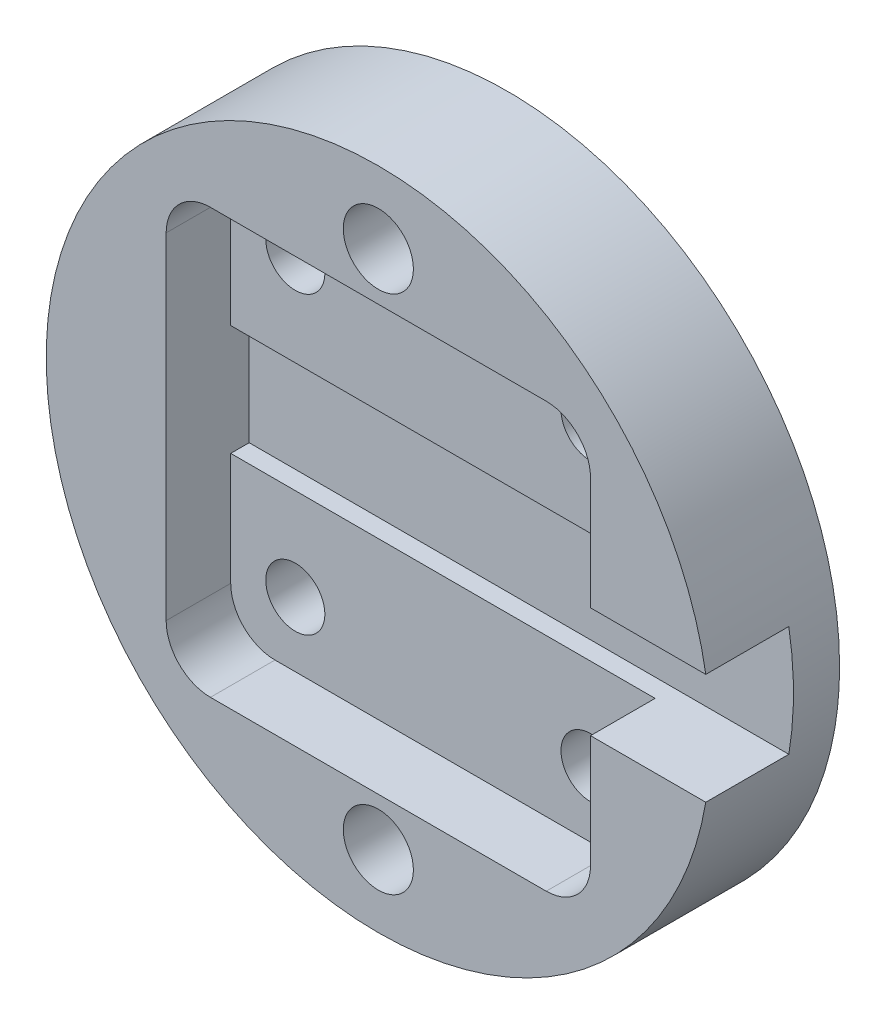
ISO-10303-21;
HEADER;
FILE_DESCRIPTION(('STEP AP214'),'2;1');
FILE_NAME('part.step','',(''),(''),'','','');
FILE_SCHEMA(('AUTOMOTIVE_DESIGN { 1 0 10303 214 1 1 1 1 }'));
ENDSEC;
DATA;
#1=APPLICATION_CONTEXT('core data for automotive mechanical design processes');
#2=APPLICATION_PROTOCOL_DEFINITION('international standard','automotive_design',2000,#1);
#3=PRODUCT_CONTEXT('',#1,'mechanical');
#4=PRODUCT('Part','Part','',(#3));
#5=PRODUCT_RELATED_PRODUCT_CATEGORY('part','',(#4));
#6=PRODUCT_DEFINITION_FORMATION('','',#4);
#7=PRODUCT_DEFINITION_CONTEXT('part definition',#1,'design');
#8=PRODUCT_DEFINITION('design','',#6,#7);
#9=PRODUCT_DEFINITION_SHAPE('','',#8);
#10=(LENGTH_UNIT() NAMED_UNIT(*) SI_UNIT(.MILLI.,.METRE.));
#11=(NAMED_UNIT(*) PLANE_ANGLE_UNIT() SI_UNIT($,.RADIAN.));
#12=(NAMED_UNIT(*) SI_UNIT($,.STERADIAN.) SOLID_ANGLE_UNIT());
#13=UNCERTAINTY_MEASURE_WITH_UNIT(LENGTH_MEASURE(1.E-05),#10,'distance_accuracy_value','');
#14=(GEOMETRIC_REPRESENTATION_CONTEXT(3) GLOBAL_UNCERTAINTY_ASSIGNED_CONTEXT((#13)) GLOBAL_UNIT_ASSIGNED_CONTEXT((#10,
#11,#12)) REPRESENTATION_CONTEXT('',''));
#15=CARTESIAN_POINT('',(0.,0.,0.));
#16=DIRECTION('',(0.,0.,1.));
#17=DIRECTION('',(1.,0.,0.));
#18=AXIS2_PLACEMENT_3D('',#15,#16,#17);
#19=CARTESIAN_POINT('',(11.5,0.,3.5));
#20=DIRECTION('',(-1.,0.,0.));
#21=DIRECTION('',(0.,0.,1.));
#22=AXIS2_PLACEMENT_3D('',#19,#20,#21);
#23=PLANE('',#22);
#24=DIRECTION('',(0.,-1.,0.));
#25=VECTOR('',#24,1.);
#26=CARTESIAN_POINT('',(11.5,0.,3.5));
#27=LINE('',#26,#25);
#28=CARTESIAN_POINT('',(11.5,-3.,3.5));
#29=VERTEX_POINT('',#28);
#30=CARTESIAN_POINT('',(11.5,-9.1,3.5));
#31=VERTEX_POINT('',#30);
#32=EDGE_CURVE('E199',#29,#31,#27,.T.);
#33=ORIENTED_EDGE('',*,*,#32,.T.);
#34=DIRECTION('',(0.,0.,1.));
#35=VECTOR('',#34,1.);
#36=CARTESIAN_POINT('',(11.5,-9.1,3.5));
#37=LINE('',#36,#35);
#38=CARTESIAN_POINT('',(11.5,-9.1,7.));
#39=VERTEX_POINT('',#38);
#40=EDGE_CURVE('E267',#31,#39,#37,.T.);
#41=ORIENTED_EDGE('',*,*,#40,.T.);
#42=DIRECTION('',(0.,-1.,0.));
#43=VECTOR('',#42,1.);
#44=CARTESIAN_POINT('',(11.5,0.,7.));
#45=LINE('',#44,#43);
#46=CARTESIAN_POINT('',(11.5,-3.,7.));
#47=VERTEX_POINT('',#46);
#48=EDGE_CURVE('E213',#47,#39,#45,.T.);
#49=ORIENTED_EDGE('',*,*,#48,.F.);
#50=DIRECTION('',(0.,0.,1.));
#51=VECTOR('',#50,1.);
#52=CARTESIAN_POINT('',(11.5,-3.,3.5));
#53=LINE('',#52,#51);
#54=EDGE_CURVE('E181',#29,#47,#53,.T.);
#55=ORIENTED_EDGE('',*,*,#54,.F.);
#56=EDGE_LOOP('',(#33,#41,#49,#55));
#57=FACE_BOUND('',#56,.T.);
#58=ADVANCED_FACE('F44',(#57),#23,.T.);
#59=CARTESIAN_POINT('',(0.,0.,3.5));
#60=DIRECTION('',(0.,0.,-1.));
#61=DIRECTION('',(-1.,0.,0.));
#62=AXIS2_PLACEMENT_3D('',#59,#60,#61);
#63=PLANE('',#62);
#64=CARTESIAN_POINT('',(8.,-8.,3.5));
#65=DIRECTION('',(0.,0.,-1.));
#66=DIRECTION('',(-1.,0.,0.));
#67=AXIS2_PLACEMENT_3D('',#64,#65,#66);
#68=CIRCLE('',#67,1.6);
#69=CARTESIAN_POINT('',(6.4,-8.,3.5));
#70=VERTEX_POINT('',#69);
#71=EDGE_CURVE('E195',#70,#70,#68,.F.);
#72=ORIENTED_EDGE('',*,*,#71,.F.);
#73=EDGE_LOOP('',(#72));
#74=FACE_BOUND('',#73,.T.);
#75=CARTESIAN_POINT('',(-8.,-8.,3.5));
#76=DIRECTION('',(0.,0.,-1.));
#77=DIRECTION('',(-1.,0.,0.));
#78=AXIS2_PLACEMENT_3D('',#75,#76,#77);
#79=CIRCLE('',#78,1.6);
#80=CARTESIAN_POINT('',(-9.6,-8.,3.5));
#81=VERTEX_POINT('',#80);
#82=EDGE_CURVE('E214',#81,#81,#79,.F.);
#83=ORIENTED_EDGE('',*,*,#82,.F.);
#84=EDGE_LOOP('',(#83));
#85=FACE_BOUND('',#84,.T.);
#86=DIRECTION('',(0.,-1.,0.));
#87=VECTOR('',#86,1.);
#88=CARTESIAN_POINT('',(-11.5,0.,3.5));
#89=LINE('',#88,#87);
#90=CARTESIAN_POINT('',(-11.5,-3.,3.5));
#91=VERTEX_POINT('',#90);
#92=CARTESIAN_POINT('',(-11.5,-9.1,3.5));
#93=VERTEX_POINT('',#92);
#94=EDGE_CURVE('E206',#91,#93,#89,.T.);
#95=ORIENTED_EDGE('',*,*,#94,.T.);
#96=CARTESIAN_POINT('',(-9.1,-9.1,3.5));
#97=DIRECTION('',(0.,0.,-1.));
#98=DIRECTION('',(-1.,0.,0.));
#99=AXIS2_PLACEMENT_3D('',#96,#97,#98);
#100=CIRCLE('',#99,2.4);
#101=CARTESIAN_POINT('',(-9.1,-11.5,3.5));
#102=VERTEX_POINT('',#101);
#103=EDGE_CURVE('E265',#93,#102,#100,.F.);
#104=ORIENTED_EDGE('',*,*,#103,.T.);
#105=DIRECTION('',(1.,0.,0.));
#106=VECTOR('',#105,1.);
#107=CARTESIAN_POINT('',(0.,-11.5,3.5));
#108=LINE('',#107,#106);
#109=CARTESIAN_POINT('',(9.1,-11.5,3.5));
#110=VERTEX_POINT('',#109);
#111=EDGE_CURVE('E196',#102,#110,#108,.T.);
#112=ORIENTED_EDGE('',*,*,#111,.T.);
#113=CARTESIAN_POINT('',(9.1,-9.1,3.5));
#114=DIRECTION('',(0.,0.,-1.));
#115=DIRECTION('',(-1.,0.,0.));
#116=AXIS2_PLACEMENT_3D('',#113,#114,#115);
#117=CIRCLE('',#116,2.4);
#118=EDGE_CURVE('E263',#110,#31,#117,.F.);
#119=ORIENTED_EDGE('',*,*,#118,.T.);
#120=ORIENTED_EDGE('',*,*,#32,.F.);
#121=DIRECTION('',(-1.,0.,0.));
#122=VECTOR('',#121,1.);
#123=CARTESIAN_POINT('',(0.,-3.,3.5));
#124=LINE('',#123,#122);
#125=EDGE_CURVE('E250',#29,#91,#124,.T.);
#126=ORIENTED_EDGE('',*,*,#125,.T.);
#127=EDGE_LOOP('',(#95,#104,#112,#119,#120,#126));
#128=FACE_BOUND('',#127,.T.);
#129=ADVANCED_FACE('F301',(#74,#85,#128),#63,.F.);
#130=CARTESIAN_POINT('',(0.,14.1,7.));
#131=DIRECTION('',(0.,0.,-1.));
#132=DIRECTION('',(-1.,0.,0.));
#133=AXIS2_PLACEMENT_3D('',#130,#131,#132);
#134=CYLINDRICAL_SURFACE('',#133,1.9);
#135=CARTESIAN_POINT('',(0.,14.1,7.));
#136=DIRECTION('',(0.,0.,1.));
#137=DIRECTION('',(1.,0.,0.));
#138=AXIS2_PLACEMENT_3D('',#135,#136,#137);
#139=CIRCLE('',#138,1.9);
#140=CARTESIAN_POINT('',(1.9,14.1,7.));
#141=VERTEX_POINT('',#140);
#142=EDGE_CURVE('E224',#141,#141,#139,.T.);
#143=ORIENTED_EDGE('',*,*,#142,.T.);
#144=EDGE_LOOP('',(#143));
#145=FACE_BOUND('',#144,.T.);
#146=CARTESIAN_POINT('',(0.,14.1,0.));
#147=DIRECTION('',(0.,0.,1.));
#148=DIRECTION('',(1.,0.,0.));
#149=AXIS2_PLACEMENT_3D('',#146,#147,#148);
#150=CIRCLE('',#149,1.9);
#151=CARTESIAN_POINT('',(1.9,14.1,0.));
#152=VERTEX_POINT('',#151);
#153=EDGE_CURVE('E233',#152,#152,#150,.T.);
#154=ORIENTED_EDGE('',*,*,#153,.F.);
#155=EDGE_LOOP('',(#154));
#156=FACE_BOUND('',#155,.T.);
#157=ADVANCED_FACE('F352',(#145,#156),#134,.F.);
#158=CARTESIAN_POINT('',(0.,-14.1,7.));
#159=DIRECTION('',(0.,0.,-1.));
#160=DIRECTION('',(-1.,0.,0.));
#161=AXIS2_PLACEMENT_3D('',#158,#159,#160);
#162=CYLINDRICAL_SURFACE('',#161,1.9);
#163=CARTESIAN_POINT('',(0.,-14.1,7.));
#164=DIRECTION('',(0.,0.,1.));
#165=DIRECTION('',(1.,0.,0.));
#166=AXIS2_PLACEMENT_3D('',#163,#164,#165);
#167=CIRCLE('',#166,1.9);
#168=CARTESIAN_POINT('',(1.9,-14.1,7.));
#169=VERTEX_POINT('',#168);
#170=EDGE_CURVE('E221',#169,#169,#167,.T.);
#171=ORIENTED_EDGE('',*,*,#170,.T.);
#172=EDGE_LOOP('',(#171));
#173=FACE_BOUND('',#172,.T.);
#174=CARTESIAN_POINT('',(0.,-14.1,0.));
#175=DIRECTION('',(0.,0.,1.));
#176=DIRECTION('',(1.,0.,0.));
#177=AXIS2_PLACEMENT_3D('',#174,#175,#176);
#178=CIRCLE('',#177,1.9);
#179=CARTESIAN_POINT('',(1.9,-14.1,0.));
#180=VERTEX_POINT('',#179);
#181=EDGE_CURVE('E209',#180,#180,#178,.T.);
#182=ORIENTED_EDGE('',*,*,#181,.F.);
#183=EDGE_LOOP('',(#182));
#184=FACE_BOUND('',#183,.T.);
#185=ADVANCED_FACE('F504',(#173,#184),#162,.F.);
#186=CARTESIAN_POINT('',(0.,0.,7.));
#187=DIRECTION('',(0.,0.,-1.));
#188=DIRECTION('',(-1.,0.,0.));
#189=AXIS2_PLACEMENT_3D('',#186,#187,#188);
#190=CYLINDRICAL_SURFACE('',#189,18.);
#191=CARTESIAN_POINT('',(0.,0.,2.5));
#192=DIRECTION('',(0.,0.,-1.));
#193=DIRECTION('',(-1.,0.,0.));
#194=AXIS2_PLACEMENT_3D('',#191,#192,#193);
#195=CIRCLE('',#194,18.);
#196=CARTESIAN_POINT('',(17.7482393492988,-3.,2.5));
#197=VERTEX_POINT('',#196);
#198=CARTESIAN_POINT('',(17.7482393492988,3.,2.5));
#199=VERTEX_POINT('',#198);
#200=EDGE_CURVE('E153',#197,#199,#195,.F.);
#201=ORIENTED_EDGE('',*,*,#200,.F.);
#202=DIRECTION('',(0.,0.,1.));
#203=VECTOR('',#202,1.);
#204=CARTESIAN_POINT('',(17.7482393492988,-3.,-28.6039864469807));
#205=LINE('',#204,#203);
#206=CARTESIAN_POINT('',(17.7482393492988,-3.,7.));
#207=VERTEX_POINT('',#206);
#208=EDGE_CURVE('E142',#197,#207,#205,.T.);
#209=ORIENTED_EDGE('',*,*,#208,.T.);
#210=CARTESIAN_POINT('',(0.,0.,7.));
#211=DIRECTION('',(0.,0.,1.));
#212=DIRECTION('',(1.,0.,0.));
#213=AXIS2_PLACEMENT_3D('',#210,#211,#212);
#214=CIRCLE('',#213,18.);
#215=CARTESIAN_POINT('',(17.7482393492988,3.,7.));
#216=VERTEX_POINT('',#215);
#217=EDGE_CURVE('E228',#216,#207,#214,.T.);
#218=ORIENTED_EDGE('',*,*,#217,.F.);
#219=DIRECTION('',(0.,0.,1.));
#220=VECTOR('',#219,1.);
#221=CARTESIAN_POINT('',(17.7482393492988,3.,-28.6039864469807));
#222=LINE('',#221,#220);
#223=EDGE_CURVE('E166',#199,#216,#222,.T.);
#224=ORIENTED_EDGE('',*,*,#223,.F.);
#225=EDGE_LOOP('',(#201,#209,#218,#224));
#226=FACE_BOUND('',#225,.T.);
#227=CARTESIAN_POINT('',(0.,0.,0.));
#228=DIRECTION('',(0.,0.,1.));
#229=DIRECTION('',(1.,0.,0.));
#230=AXIS2_PLACEMENT_3D('',#227,#228,#229);
#231=CIRCLE('',#230,18.);
#232=CARTESIAN_POINT('',(18.,0.,0.));
#233=VERTEX_POINT('',#232);
#234=EDGE_CURVE('E225',#233,#233,#231,.T.);
#235=ORIENTED_EDGE('',*,*,#234,.T.);
#236=EDGE_LOOP('',(#235));
#237=FACE_BOUND('',#236,.T.);
#238=ADVANCED_FACE('F164',(#226,#237),#190,.T.);
#239=CARTESIAN_POINT('',(0.,0.,7.));
#240=DIRECTION('',(0.,0.,1.));
#241=DIRECTION('',(1.,0.,0.));
#242=AXIS2_PLACEMENT_3D('',#239,#240,#241);
#243=PLANE('',#242);
#244=DIRECTION('',(1.,0.,0.));
#245=VECTOR('',#244,1.);
#246=CARTESIAN_POINT('',(-11.5,-3.,7.));
#247=LINE('',#246,#245);
#248=EDGE_CURVE('E148',#47,#207,#247,.T.);
#249=ORIENTED_EDGE('',*,*,#248,.F.);
#250=ORIENTED_EDGE('',*,*,#48,.T.);
#251=CARTESIAN_POINT('',(9.1,-9.1,7.));
#252=DIRECTION('',(0.,0.,1.));
#253=DIRECTION('',(1.,0.,0.));
#254=AXIS2_PLACEMENT_3D('',#251,#252,#253);
#255=CIRCLE('',#254,2.4);
#256=CARTESIAN_POINT('',(9.1,-11.5,7.));
#257=VERTEX_POINT('',#256);
#258=EDGE_CURVE('E282',#39,#257,#255,.F.);
#259=ORIENTED_EDGE('',*,*,#258,.T.);
#260=DIRECTION('',(1.,0.,0.));
#261=VECTOR('',#260,1.);
#262=CARTESIAN_POINT('',(0.,-11.5,7.));
#263=LINE('',#262,#261);
#264=CARTESIAN_POINT('',(-9.1,-11.5,7.));
#265=VERTEX_POINT('',#264);
#266=EDGE_CURVE('E210',#265,#257,#263,.T.);
#267=ORIENTED_EDGE('',*,*,#266,.F.);
#268=CARTESIAN_POINT('',(-9.1,-9.1,7.));
#269=DIRECTION('',(0.,0.,1.));
#270=DIRECTION('',(1.,0.,0.));
#271=AXIS2_PLACEMENT_3D('',#268,#269,#270);
#272=CIRCLE('',#271,2.4);
#273=CARTESIAN_POINT('',(-11.5,-9.1,7.));
#274=VERTEX_POINT('',#273);
#275=EDGE_CURVE('E280',#265,#274,#272,.F.);
#276=ORIENTED_EDGE('',*,*,#275,.T.);
#277=DIRECTION('',(0.,-1.,0.));
#278=VECTOR('',#277,1.);
#279=CARTESIAN_POINT('',(-11.5,0.,7.));
#280=LINE('',#279,#278);
#281=CARTESIAN_POINT('',(-11.5,9.1,7.));
#282=VERTEX_POINT('',#281);
#283=EDGE_CURVE('E200',#282,#274,#280,.T.);
#284=ORIENTED_EDGE('',*,*,#283,.F.);
#285=CARTESIAN_POINT('',(-9.1,9.1,7.));
#286=DIRECTION('',(0.,0.,1.));
#287=DIRECTION('',(1.,0.,0.));
#288=AXIS2_PLACEMENT_3D('',#285,#286,#287);
#289=CIRCLE('',#288,2.4);
#290=CARTESIAN_POINT('',(-9.1,11.5,7.));
#291=VERTEX_POINT('',#290);
#292=EDGE_CURVE('E13',#282,#291,#289,.F.);
#293=ORIENTED_EDGE('',*,*,#292,.T.);
#294=DIRECTION('',(1.,0.,0.));
#295=VECTOR('',#294,1.);
#296=CARTESIAN_POINT('',(0.,11.5,7.));
#297=LINE('',#296,#295);
#298=CARTESIAN_POINT('',(9.1,11.5,7.));
#299=VERTEX_POINT('',#298);
#300=EDGE_CURVE('E217',#291,#299,#297,.T.);
#301=ORIENTED_EDGE('',*,*,#300,.T.);
#302=CARTESIAN_POINT('',(9.1,9.1,7.));
#303=DIRECTION('',(0.,0.,1.));
#304=DIRECTION('',(1.,0.,0.));
#305=AXIS2_PLACEMENT_3D('',#302,#303,#304);
#306=CIRCLE('',#305,2.4);
#307=CARTESIAN_POINT('',(11.5,9.1,7.));
#308=VERTEX_POINT('',#307);
#309=EDGE_CURVE('E52',#299,#308,#306,.F.);
#310=ORIENTED_EDGE('',*,*,#309,.T.);
#311=CARTESIAN_POINT('',(11.5,3.,7.));
#312=VERTEX_POINT('',#311);
#313=EDGE_CURVE('E215',#308,#312,#45,.T.);
#314=ORIENTED_EDGE('',*,*,#313,.T.);
#315=DIRECTION('',(-1.,0.,0.));
#316=VECTOR('',#315,1.);
#317=CARTESIAN_POINT('',(-11.5,3.,7.));
#318=LINE('',#317,#316);
#319=EDGE_CURVE('E162',#216,#312,#318,.T.);
#320=ORIENTED_EDGE('',*,*,#319,.F.);
#321=ORIENTED_EDGE('',*,*,#217,.T.);
#322=EDGE_LOOP('',(#249,#250,#259,#267,#276,#284,#293,#301,#310,#314,#320,#321));
#323=FACE_BOUND('',#322,.T.);
#324=ORIENTED_EDGE('',*,*,#170,.F.);
#325=EDGE_LOOP('',(#324));
#326=FACE_BOUND('',#325,.T.);
#327=ORIENTED_EDGE('',*,*,#142,.F.);
#328=EDGE_LOOP('',(#327));
#329=FACE_BOUND('',#328,.T.);
#330=ADVANCED_FACE('F285',(#323,#326,#329),#243,.T.);
#331=CARTESIAN_POINT('',(0.,0.,0.));
#332=DIRECTION('',(0.,0.,1.));
#333=DIRECTION('',(1.,0.,0.));
#334=AXIS2_PLACEMENT_3D('',#331,#332,#333);
#335=PLANE('',#334);
#336=CARTESIAN_POINT('',(-8.,-8.,0.));
#337=DIRECTION('',(0.,0.,1.));
#338=DIRECTION('',(1.,0.,0.));
#339=AXIS2_PLACEMENT_3D('',#336,#337,#338);
#340=CIRCLE('',#339,1.6);
#341=CARTESIAN_POINT('',(-6.4,-8.,0.));
#342=VERTEX_POINT('',#341);
#343=EDGE_CURVE('E183',#342,#342,#340,.T.);
#344=ORIENTED_EDGE('',*,*,#343,.T.);
#345=EDGE_LOOP('',(#344));
#346=FACE_BOUND('',#345,.T.);
#347=CARTESIAN_POINT('',(-8.,8.,0.));
#348=DIRECTION('',(0.,0.,1.));
#349=DIRECTION('',(1.,0.,0.));
#350=AXIS2_PLACEMENT_3D('',#347,#348,#349);
#351=CIRCLE('',#350,1.6);
#352=CARTESIAN_POINT('',(-6.4,8.,0.));
#353=VERTEX_POINT('',#352);
#354=EDGE_CURVE('E188',#353,#353,#351,.T.);
#355=ORIENTED_EDGE('',*,*,#354,.T.);
#356=EDGE_LOOP('',(#355));
#357=FACE_BOUND('',#356,.T.);
#358=CARTESIAN_POINT('',(8.,8.,0.));
#359=DIRECTION('',(0.,0.,1.));
#360=DIRECTION('',(1.,0.,0.));
#361=AXIS2_PLACEMENT_3D('',#358,#359,#360);
#362=CIRCLE('',#361,1.6);
#363=CARTESIAN_POINT('',(9.6,8.,0.));
#364=VERTEX_POINT('',#363);
#365=EDGE_CURVE('E184',#364,#364,#362,.T.);
#366=ORIENTED_EDGE('',*,*,#365,.T.);
#367=EDGE_LOOP('',(#366));
#368=FACE_BOUND('',#367,.T.);
#369=CARTESIAN_POINT('',(8.,-8.,0.));
#370=DIRECTION('',(0.,0.,1.));
#371=DIRECTION('',(1.,0.,0.));
#372=AXIS2_PLACEMENT_3D('',#369,#370,#371);
#373=CIRCLE('',#372,1.6);
#374=CARTESIAN_POINT('',(9.6,-8.,0.));
#375=VERTEX_POINT('',#374);
#376=EDGE_CURVE('E187',#375,#375,#373,.T.);
#377=ORIENTED_EDGE('',*,*,#376,.T.);
#378=EDGE_LOOP('',(#377));
#379=FACE_BOUND('',#378,.T.);
#380=ORIENTED_EDGE('',*,*,#181,.T.);
#381=EDGE_LOOP('',(#380));
#382=FACE_BOUND('',#381,.T.);
#383=ORIENTED_EDGE('',*,*,#153,.T.);
#384=EDGE_LOOP('',(#383));
#385=FACE_BOUND('',#384,.T.);
#386=ORIENTED_EDGE('',*,*,#234,.F.);
#387=EDGE_LOOP('',(#386));
#388=FACE_BOUND('',#387,.T.);
#389=ADVANCED_FACE('F484',(#346,#357,#368,#379,#382,#385,#388),#335,.F.);
#390=CARTESIAN_POINT('',(0.,-11.5,3.5));
#391=DIRECTION('',(0.,-1.,0.));
#392=DIRECTION('',(0.,0.,-1.));
#393=AXIS2_PLACEMENT_3D('',#390,#391,#392);
#394=PLANE('',#393);
#395=ORIENTED_EDGE('',*,*,#111,.F.);
#396=DIRECTION('',(0.,0.,1.));
#397=VECTOR('',#396,1.);
#398=CARTESIAN_POINT('',(-9.1,-11.5,7.));
#399=LINE('',#398,#397);
#400=EDGE_CURVE('E255',#102,#265,#399,.T.);
#401=ORIENTED_EDGE('',*,*,#400,.T.);
#402=ORIENTED_EDGE('',*,*,#266,.T.);
#403=DIRECTION('',(0.,0.,1.));
#404=VECTOR('',#403,1.);
#405=CARTESIAN_POINT('',(9.1,-11.5,3.5));
#406=LINE('',#405,#404);
#407=EDGE_CURVE('E253',#257,#110,#406,.F.);
#408=ORIENTED_EDGE('',*,*,#407,.T.);
#409=EDGE_LOOP('',(#395,#401,#402,#408));
#410=FACE_BOUND('',#409,.T.);
#411=ADVANCED_FACE('F293',(#410),#394,.F.);
#412=CARTESIAN_POINT('',(-11.5,0.,3.5));
#413=DIRECTION('',(-1.,0.,0.));
#414=DIRECTION('',(0.,0.,1.));
#415=AXIS2_PLACEMENT_3D('',#412,#413,#414);
#416=PLANE('',#415);
#417=ORIENTED_EDGE('',*,*,#283,.T.);
#418=DIRECTION('',(0.,0.,1.));
#419=VECTOR('',#418,1.);
#420=CARTESIAN_POINT('',(-11.5,-9.1,3.5));
#421=LINE('',#420,#419);
#422=EDGE_CURVE('E261',#274,#93,#421,.F.);
#423=ORIENTED_EDGE('',*,*,#422,.T.);
#424=ORIENTED_EDGE('',*,*,#94,.F.);
#425=DIRECTION('',(0.,0.,1.));
#426=VECTOR('',#425,1.);
#427=CARTESIAN_POINT('',(-11.5,-3.,-28.6039864469807));
#428=LINE('',#427,#426);
#429=CARTESIAN_POINT('',(-11.5,-3.,2.5));
#430=VERTEX_POINT('',#429);
#431=EDGE_CURVE('E176',#430,#91,#428,.T.);
#432=ORIENTED_EDGE('',*,*,#431,.F.);
#433=DIRECTION('',(0.,-1.,0.));
#434=VECTOR('',#433,1.);
#435=CARTESIAN_POINT('',(-11.5,3.,2.5));
#436=LINE('',#435,#434);
#437=CARTESIAN_POINT('',(-11.5,3.,2.5));
#438=VERTEX_POINT('',#437);
#439=EDGE_CURVE('E160',#438,#430,#436,.T.);
#440=ORIENTED_EDGE('',*,*,#439,.F.);
#441=DIRECTION('',(0.,0.,1.));
#442=VECTOR('',#441,1.);
#443=CARTESIAN_POINT('',(-11.5,3.,-28.6039864469807));
#444=LINE('',#443,#442);
#445=CARTESIAN_POINT('',(-11.5,3.,3.5));
#446=VERTEX_POINT('',#445);
#447=EDGE_CURVE('E173',#438,#446,#444,.T.);
#448=ORIENTED_EDGE('',*,*,#447,.T.);
#449=CARTESIAN_POINT('',(-11.5,9.1,3.5));
#450=VERTEX_POINT('',#449);
#451=EDGE_CURVE('E207',#450,#446,#89,.T.);
#452=ORIENTED_EDGE('',*,*,#451,.F.);
#453=DIRECTION('',(0.,0.,1.));
#454=VECTOR('',#453,1.);
#455=CARTESIAN_POINT('',(-11.5,9.1,3.5));
#456=LINE('',#455,#454);
#457=EDGE_CURVE('E258',#450,#282,#456,.T.);
#458=ORIENTED_EDGE('',*,*,#457,.T.);
#459=EDGE_LOOP('',(#417,#423,#424,#432,#440,#448,#452,#458));
#460=FACE_BOUND('',#459,.T.);
#461=ADVANCED_FACE('F330',(#460),#416,.F.);
#462=CARTESIAN_POINT('',(0.,11.5,3.5));
#463=DIRECTION('',(0.,-1.,0.));
#464=DIRECTION('',(0.,0.,-1.));
#465=AXIS2_PLACEMENT_3D('',#462,#463,#464);
#466=PLANE('',#465);
#467=DIRECTION('',(1.,0.,0.));
#468=VECTOR('',#467,1.);
#469=CARTESIAN_POINT('',(0.,11.5,3.5));
#470=LINE('',#469,#468);
#471=CARTESIAN_POINT('',(-9.1,11.5,3.5));
#472=VERTEX_POINT('',#471);
#473=CARTESIAN_POINT('',(9.1,11.5,3.5));
#474=VERTEX_POINT('',#473);
#475=EDGE_CURVE('E203',#472,#474,#470,.T.);
#476=ORIENTED_EDGE('',*,*,#475,.T.);
#477=DIRECTION('',(0.,0.,1.));
#478=VECTOR('',#477,1.);
#479=CARTESIAN_POINT('',(9.1,11.5,7.));
#480=LINE('',#479,#478);
#481=EDGE_CURVE('E272',#474,#299,#480,.T.);
#482=ORIENTED_EDGE('',*,*,#481,.T.);
#483=ORIENTED_EDGE('',*,*,#300,.F.);
#484=DIRECTION('',(0.,0.,1.));
#485=VECTOR('',#484,1.);
#486=CARTESIAN_POINT('',(-9.1,11.5,3.5));
#487=LINE('',#486,#485);
#488=EDGE_CURVE('E270',#291,#472,#487,.F.);
#489=ORIENTED_EDGE('',*,*,#488,.T.);
#490=EDGE_LOOP('',(#476,#482,#483,#489));
#491=FACE_BOUND('',#490,.T.);
#492=ADVANCED_FACE('F322',(#491),#466,.T.);
#493=ORIENTED_EDGE('',*,*,#313,.F.);
#494=DIRECTION('',(0.,0.,1.));
#495=VECTOR('',#494,1.);
#496=CARTESIAN_POINT('',(11.5,9.1,3.5));
#497=LINE('',#496,#495);
#498=CARTESIAN_POINT('',(11.5,9.1,3.5));
#499=VERTEX_POINT('',#498);
#500=EDGE_CURVE('E59',#308,#499,#497,.F.);
#501=ORIENTED_EDGE('',*,*,#500,.T.);
#502=CARTESIAN_POINT('',(11.5,3.,3.5));
#503=VERTEX_POINT('',#502);
#504=EDGE_CURVE('E201',#499,#503,#27,.T.);
#505=ORIENTED_EDGE('',*,*,#504,.T.);
#506=DIRECTION('',(0.,0.,-1.));
#507=VECTOR('',#506,1.);
#508=CARTESIAN_POINT('',(11.5,3.,3.5));
#509=LINE('',#508,#507);
#510=EDGE_CURVE('E178',#312,#503,#509,.T.);
#511=ORIENTED_EDGE('',*,*,#510,.F.);
#512=EDGE_LOOP('',(#493,#501,#505,#511));
#513=FACE_BOUND('',#512,.T.);
#514=ADVANCED_FACE('F312',(#513),#23,.T.);
#515=CARTESIAN_POINT('',(-8.,8.,3.5));
#516=DIRECTION('',(0.,0.,-1.));
#517=DIRECTION('',(-1.,0.,0.));
#518=AXIS2_PLACEMENT_3D('',#515,#516,#517);
#519=CIRCLE('',#518,1.6);
#520=CARTESIAN_POINT('',(-9.6,8.,3.5));
#521=VERTEX_POINT('',#520);
#522=EDGE_CURVE('E243',#521,#521,#519,.F.);
#523=ORIENTED_EDGE('',*,*,#522,.F.);
#524=EDGE_LOOP('',(#523));
#525=FACE_BOUND('',#524,.T.);
#526=CARTESIAN_POINT('',(8.,8.,3.5));
#527=DIRECTION('',(0.,0.,-1.));
#528=DIRECTION('',(-1.,0.,0.));
#529=AXIS2_PLACEMENT_3D('',#526,#527,#528);
#530=CIRCLE('',#529,1.6);
#531=CARTESIAN_POINT('',(6.4,8.,3.5));
#532=VERTEX_POINT('',#531);
#533=EDGE_CURVE('E240',#532,#532,#530,.F.);
#534=ORIENTED_EDGE('',*,*,#533,.F.);
#535=EDGE_LOOP('',(#534));
#536=FACE_BOUND('',#535,.T.);
#537=ORIENTED_EDGE('',*,*,#504,.F.);
#538=CARTESIAN_POINT('',(9.1,9.1,3.5));
#539=DIRECTION('',(0.,0.,-1.));
#540=DIRECTION('',(-1.,0.,0.));
#541=AXIS2_PLACEMENT_3D('',#538,#539,#540);
#542=CIRCLE('',#541,2.4);
#543=EDGE_CURVE('E278',#499,#474,#542,.F.);
#544=ORIENTED_EDGE('',*,*,#543,.T.);
#545=ORIENTED_EDGE('',*,*,#475,.F.);
#546=CARTESIAN_POINT('',(-9.1,9.1,3.5));
#547=DIRECTION('',(0.,0.,-1.));
#548=DIRECTION('',(-1.,0.,0.));
#549=AXIS2_PLACEMENT_3D('',#546,#547,#548);
#550=CIRCLE('',#549,2.4);
#551=EDGE_CURVE('E276',#472,#450,#550,.F.);
#552=ORIENTED_EDGE('',*,*,#551,.T.);
#553=ORIENTED_EDGE('',*,*,#451,.T.);
#554=DIRECTION('',(1.,0.,0.));
#555=VECTOR('',#554,1.);
#556=CARTESIAN_POINT('',(0.,3.,3.5));
#557=LINE('',#556,#555);
#558=EDGE_CURVE('E230',#446,#503,#557,.T.);
#559=ORIENTED_EDGE('',*,*,#558,.T.);
#560=EDGE_LOOP('',(#537,#544,#545,#552,#553,#559));
#561=FACE_BOUND('',#560,.T.);
#562=ADVANCED_FACE('F315',(#525,#536,#561),#63,.F.);
#563=CARTESIAN_POINT('',(8.,-8.,7.));
#564=DIRECTION('',(0.,0.,-1.));
#565=DIRECTION('',(-1.,0.,0.));
#566=AXIS2_PLACEMENT_3D('',#563,#564,#565);
#567=CYLINDRICAL_SURFACE('',#566,1.6);
#568=ORIENTED_EDGE('',*,*,#376,.F.);
#569=EDGE_LOOP('',(#568));
#570=FACE_BOUND('',#569,.T.);
#571=ORIENTED_EDGE('',*,*,#71,.T.);
#572=EDGE_LOOP('',(#571));
#573=FACE_BOUND('',#572,.T.);
#574=ADVANCED_FACE('F361',(#570,#573),#567,.F.);
#575=CARTESIAN_POINT('',(8.,8.,7.));
#576=DIRECTION('',(0.,0.,-1.));
#577=DIRECTION('',(-1.,0.,0.));
#578=AXIS2_PLACEMENT_3D('',#575,#576,#577);
#579=CYLINDRICAL_SURFACE('',#578,1.6);
#580=ORIENTED_EDGE('',*,*,#365,.F.);
#581=EDGE_LOOP('',(#580));
#582=FACE_BOUND('',#581,.T.);
#583=ORIENTED_EDGE('',*,*,#533,.T.);
#584=EDGE_LOOP('',(#583));
#585=FACE_BOUND('',#584,.T.);
#586=ADVANCED_FACE('F370',(#582,#585),#579,.F.);
#587=CARTESIAN_POINT('',(-8.,8.,7.));
#588=DIRECTION('',(0.,0.,-1.));
#589=DIRECTION('',(-1.,0.,0.));
#590=AXIS2_PLACEMENT_3D('',#587,#588,#589);
#591=CYLINDRICAL_SURFACE('',#590,1.6);
#592=ORIENTED_EDGE('',*,*,#354,.F.);
#593=EDGE_LOOP('',(#592));
#594=FACE_BOUND('',#593,.T.);
#595=ORIENTED_EDGE('',*,*,#522,.T.);
#596=EDGE_LOOP('',(#595));
#597=FACE_BOUND('',#596,.T.);
#598=ADVANCED_FACE('F375',(#594,#597),#591,.F.);
#599=CARTESIAN_POINT('',(-8.,-8.,7.));
#600=DIRECTION('',(0.,0.,-1.));
#601=DIRECTION('',(-1.,0.,0.));
#602=AXIS2_PLACEMENT_3D('',#599,#600,#601);
#603=CYLINDRICAL_SURFACE('',#602,1.6);
#604=ORIENTED_EDGE('',*,*,#343,.F.);
#605=EDGE_LOOP('',(#604));
#606=FACE_BOUND('',#605,.T.);
#607=ORIENTED_EDGE('',*,*,#82,.T.);
#608=EDGE_LOOP('',(#607));
#609=FACE_BOUND('',#608,.T.);
#610=ADVANCED_FACE('F372',(#606,#609),#603,.F.);
#611=CARTESIAN_POINT('',(0.,0.,2.5));
#612=DIRECTION('',(0.,0.,-1.));
#613=DIRECTION('',(-1.,0.,0.));
#614=AXIS2_PLACEMENT_3D('',#611,#612,#613);
#615=PLANE('',#614);
#616=ORIENTED_EDGE('',*,*,#439,.T.);
#617=DIRECTION('',(1.,0.,0.));
#618=VECTOR('',#617,1.);
#619=CARTESIAN_POINT('',(-11.5,-3.,2.5));
#620=LINE('',#619,#618);
#621=EDGE_CURVE('E145',#430,#197,#620,.T.);
#622=ORIENTED_EDGE('',*,*,#621,.T.);
#623=ORIENTED_EDGE('',*,*,#200,.T.);
#624=DIRECTION('',(-1.,0.,0.));
#625=VECTOR('',#624,1.);
#626=CARTESIAN_POINT('',(-11.5,3.,2.5));
#627=LINE('',#626,#625);
#628=EDGE_CURVE('E168',#199,#438,#627,.T.);
#629=ORIENTED_EDGE('',*,*,#628,.T.);
#630=EDGE_LOOP('',(#616,#622,#623,#629));
#631=FACE_BOUND('',#630,.T.);
#632=ADVANCED_FACE('F157',(#631),#615,.F.);
#633=CARTESIAN_POINT('',(-11.5,-3.,-28.6039864469807));
#634=DIRECTION('',(0.,-1.,0.));
#635=DIRECTION('',(1.,0.,0.));
#636=AXIS2_PLACEMENT_3D('',#633,#634,#635);
#637=PLANE('',#636);
#638=ORIENTED_EDGE('',*,*,#54,.T.);
#639=ORIENTED_EDGE('',*,*,#248,.T.);
#640=ORIENTED_EDGE('',*,*,#208,.F.);
#641=ORIENTED_EDGE('',*,*,#621,.F.);
#642=ORIENTED_EDGE('',*,*,#431,.T.);
#643=ORIENTED_EDGE('',*,*,#125,.F.);
#644=EDGE_LOOP('',(#638,#639,#640,#641,#642,#643));
#645=FACE_BOUND('',#644,.T.);
#646=ADVANCED_FACE('F144',(#645),#637,.F.);
#647=CARTESIAN_POINT('',(-11.5,3.,-28.6039864469807));
#648=DIRECTION('',(0.,1.,0.));
#649=DIRECTION('',(0.,0.,1.));
#650=AXIS2_PLACEMENT_3D('',#647,#648,#649);
#651=PLANE('',#650);
#652=ORIENTED_EDGE('',*,*,#510,.T.);
#653=ORIENTED_EDGE('',*,*,#558,.F.);
#654=ORIENTED_EDGE('',*,*,#447,.F.);
#655=ORIENTED_EDGE('',*,*,#628,.F.);
#656=ORIENTED_EDGE('',*,*,#223,.T.);
#657=ORIENTED_EDGE('',*,*,#319,.T.);
#658=EDGE_LOOP('',(#652,#653,#654,#655,#656,#657));
#659=FACE_BOUND('',#658,.T.);
#660=ADVANCED_FACE('F310',(#659),#651,.F.);
#661=CARTESIAN_POINT('',(-9.1,-9.1,3.5));
#662=DIRECTION('',(0.,0.,-1.));
#663=DIRECTION('',(-1.,0.,0.));
#664=AXIS2_PLACEMENT_3D('',#661,#662,#663);
#665=CYLINDRICAL_SURFACE('',#664,2.4);
#666=ORIENTED_EDGE('',*,*,#103,.F.);
#667=ORIENTED_EDGE('',*,*,#422,.F.);
#668=ORIENTED_EDGE('',*,*,#275,.F.);
#669=ORIENTED_EDGE('',*,*,#400,.F.);
#670=EDGE_LOOP('',(#666,#667,#668,#669));
#671=FACE_BOUND('',#670,.T.);
#672=ADVANCED_FACE('F336',(#671),#665,.F.);
#673=CARTESIAN_POINT('',(9.1,-9.1,3.5));
#674=DIRECTION('',(0.,0.,1.));
#675=DIRECTION('',(1.,0.,0.));
#676=AXIS2_PLACEMENT_3D('',#673,#674,#675);
#677=CYLINDRICAL_SURFACE('',#676,2.4);
#678=ORIENTED_EDGE('',*,*,#118,.F.);
#679=ORIENTED_EDGE('',*,*,#407,.F.);
#680=ORIENTED_EDGE('',*,*,#258,.F.);
#681=ORIENTED_EDGE('',*,*,#40,.F.);
#682=EDGE_LOOP('',(#678,#679,#680,#681));
#683=FACE_BOUND('',#682,.T.);
#684=ADVANCED_FACE('F296',(#683),#677,.F.);
#685=CARTESIAN_POINT('',(9.1,9.1,3.5));
#686=DIRECTION('',(0.,0.,-1.));
#687=DIRECTION('',(-1.,0.,0.));
#688=AXIS2_PLACEMENT_3D('',#685,#686,#687);
#689=CYLINDRICAL_SURFACE('',#688,2.4);
#690=ORIENTED_EDGE('',*,*,#543,.F.);
#691=ORIENTED_EDGE('',*,*,#500,.F.);
#692=ORIENTED_EDGE('',*,*,#309,.F.);
#693=ORIENTED_EDGE('',*,*,#481,.F.);
#694=EDGE_LOOP('',(#690,#691,#692,#693));
#695=FACE_BOUND('',#694,.T.);
#696=ADVANCED_FACE('F319',(#695),#689,.F.);
#697=CARTESIAN_POINT('',(-9.1,9.1,3.5));
#698=DIRECTION('',(0.,0.,1.));
#699=DIRECTION('',(1.,0.,0.));
#700=AXIS2_PLACEMENT_3D('',#697,#698,#699);
#701=CYLINDRICAL_SURFACE('',#700,2.4);
#702=ORIENTED_EDGE('',*,*,#551,.F.);
#703=ORIENTED_EDGE('',*,*,#488,.F.);
#704=ORIENTED_EDGE('',*,*,#292,.F.);
#705=ORIENTED_EDGE('',*,*,#457,.F.);
#706=EDGE_LOOP('',(#702,#703,#704,#705));
#707=FACE_BOUND('',#706,.T.);
#708=ADVANCED_FACE('F46',(#707),#701,.F.);
#709=CLOSED_SHELL('',(#58,#129,#157,#185,#238,#330,#389,#411,#461,#492,#514,#562,#574,#586,#598,
#610,#632,#646,#660,#672,#684,#696,#708));
#710=MANIFOLD_SOLID_BREP('B2',#709);
#711=ADVANCED_BREP_SHAPE_REPRESENTATION('',(#18,#710),#14);
#712=SHAPE_DEFINITION_REPRESENTATION(#9,#711);
ENDSEC;
END-ISO-10303-21;
